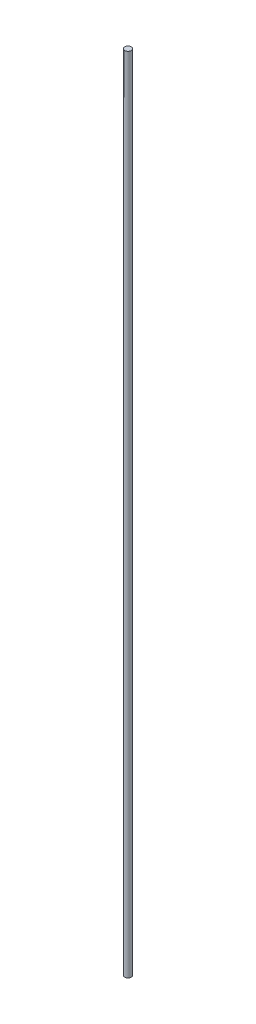
ISO-10303-21;
HEADER;
FILE_DESCRIPTION(('STEP AP214'),'2;1');
FILE_NAME('part.step','',(''),(''),'','','');
FILE_SCHEMA(('AUTOMOTIVE_DESIGN { 1 0 10303 214 1 1 1 1 }'));
ENDSEC;
DATA;
#1=APPLICATION_CONTEXT('core data for automotive mechanical design processes');
#2=APPLICATION_PROTOCOL_DEFINITION('international standard','automotive_design',2000,#1);
#3=PRODUCT_CONTEXT('',#1,'mechanical');
#4=PRODUCT('Part','Part','',(#3));
#5=PRODUCT_RELATED_PRODUCT_CATEGORY('part','',(#4));
#6=PRODUCT_DEFINITION_FORMATION('','',#4);
#7=PRODUCT_DEFINITION_CONTEXT('part definition',#1,'design');
#8=PRODUCT_DEFINITION('design','',#6,#7);
#9=PRODUCT_DEFINITION_SHAPE('','',#8);
#10=(LENGTH_UNIT() NAMED_UNIT(*) SI_UNIT(.MILLI.,.METRE.));
#11=(NAMED_UNIT(*) PLANE_ANGLE_UNIT() SI_UNIT($,.RADIAN.));
#12=(NAMED_UNIT(*) SI_UNIT($,.STERADIAN.) SOLID_ANGLE_UNIT());
#13=UNCERTAINTY_MEASURE_WITH_UNIT(LENGTH_MEASURE(1.E-05),#10,'distance_accuracy_value','');
#14=(GEOMETRIC_REPRESENTATION_CONTEXT(3) GLOBAL_UNCERTAINTY_ASSIGNED_CONTEXT((#13)) GLOBAL_UNIT_ASSIGNED_CONTEXT((#10,
#11,#12)) REPRESENTATION_CONTEXT('',''));
#15=CARTESIAN_POINT('',(0.,0.,0.));
#16=DIRECTION('',(0.,0.,1.));
#17=DIRECTION('',(1.,0.,0.));
#18=AXIS2_PLACEMENT_3D('',#15,#16,#17);
#19=CARTESIAN_POINT('',(0.,1244.6,0.));
#20=DIRECTION('',(0.,-1.,0.));
#21=DIRECTION('',(0.,0.,-1.));
#22=AXIS2_PLACEMENT_3D('',#19,#20,#21);
#23=CYLINDRICAL_SURFACE('',#22,5.08);
#24=CARTESIAN_POINT('',(0.,1244.6,0.));
#25=DIRECTION('',(0.,1.,0.));
#26=DIRECTION('',(0.,0.,1.));
#27=AXIS2_PLACEMENT_3D('',#24,#25,#26);
#28=CIRCLE('',#27,5.08);
#29=CARTESIAN_POINT('',(0.,1244.6,5.08));
#30=VERTEX_POINT('',#29);
#31=EDGE_CURVE('E10',#30,#30,#28,.T.);
#32=ORIENTED_EDGE('',*,*,#31,.F.);
#33=EDGE_LOOP('',(#32));
#34=FACE_BOUND('',#33,.T.);
#35=CARTESIAN_POINT('',(0.,0.,0.));
#36=DIRECTION('',(0.,1.,0.));
#37=DIRECTION('',(0.,0.,1.));
#38=AXIS2_PLACEMENT_3D('',#35,#36,#37);
#39=CIRCLE('',#38,5.08);
#40=CARTESIAN_POINT('',(0.,0.,5.08));
#41=VERTEX_POINT('',#40);
#42=EDGE_CURVE('E36',#41,#41,#39,.T.);
#43=ORIENTED_EDGE('',*,*,#42,.T.);
#44=EDGE_LOOP('',(#43));
#45=FACE_BOUND('',#44,.T.);
#46=ADVANCED_FACE('F33',(#34,#45),#23,.T.);
#47=CARTESIAN_POINT('',(0.,1244.6,0.));
#48=DIRECTION('',(0.,1.,0.));
#49=DIRECTION('',(0.,0.,1.));
#50=AXIS2_PLACEMENT_3D('',#47,#48,#49);
#51=PLANE('',#50);
#52=ORIENTED_EDGE('',*,*,#31,.T.);
#53=EDGE_LOOP('',(#52));
#54=FACE_BOUND('',#53,.T.);
#55=ADVANCED_FACE('F48',(#54),#51,.T.);
#56=CARTESIAN_POINT('',(0.,0.,0.));
#57=DIRECTION('',(0.,1.,0.));
#58=DIRECTION('',(0.,0.,1.));
#59=AXIS2_PLACEMENT_3D('',#56,#57,#58);
#60=PLANE('',#59);
#61=ORIENTED_EDGE('',*,*,#42,.F.);
#62=EDGE_LOOP('',(#61));
#63=FACE_BOUND('',#62,.T.);
#64=ADVANCED_FACE('F46',(#63),#60,.F.);
#65=CLOSED_SHELL('',(#46,#55,#64));
#66=MANIFOLD_SOLID_BREP('B2',#65);
#67=ADVANCED_BREP_SHAPE_REPRESENTATION('',(#18,#66),#14);
#68=SHAPE_DEFINITION_REPRESENTATION(#9,#67);
ENDSEC;
END-ISO-10303-21;
